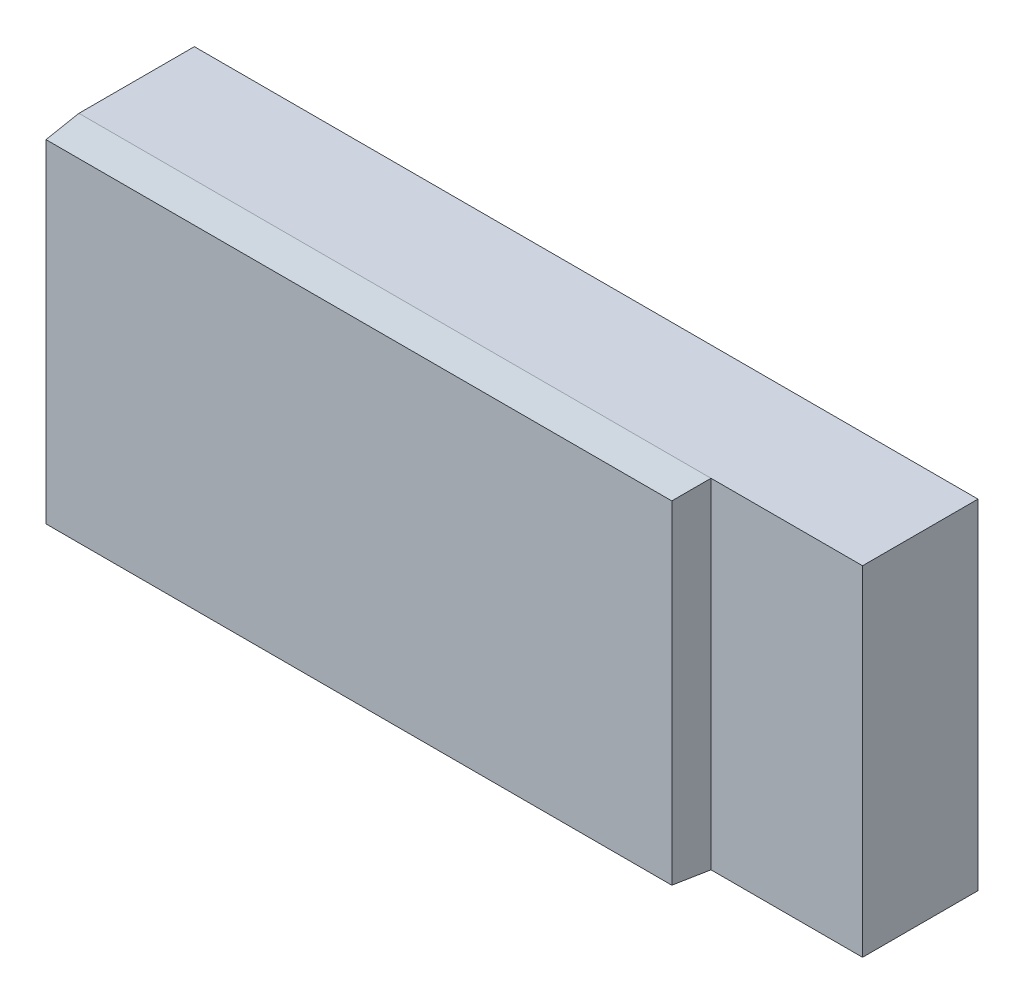
ISO-10303-21;
HEADER;
FILE_DESCRIPTION(('STEP AP214'),'2;1');
FILE_NAME('part.step','',(''),(''),'','','');
FILE_SCHEMA(('AUTOMOTIVE_DESIGN { 1 0 10303 214 1 1 1 1 }'));
ENDSEC;
DATA;
#1=APPLICATION_CONTEXT('core data for automotive mechanical design processes');
#2=APPLICATION_PROTOCOL_DEFINITION('international standard','automotive_design',2000,#1);
#3=PRODUCT_CONTEXT('',#1,'mechanical');
#4=PRODUCT('Part','Part','',(#3));
#5=PRODUCT_RELATED_PRODUCT_CATEGORY('part','',(#4));
#6=PRODUCT_DEFINITION_FORMATION('','',#4);
#7=PRODUCT_DEFINITION_CONTEXT('part definition',#1,'design');
#8=PRODUCT_DEFINITION('design','',#6,#7);
#9=PRODUCT_DEFINITION_SHAPE('','',#8);
#10=(LENGTH_UNIT() NAMED_UNIT(*) SI_UNIT(.MILLI.,.METRE.));
#11=(NAMED_UNIT(*) PLANE_ANGLE_UNIT() SI_UNIT($,.RADIAN.));
#12=(NAMED_UNIT(*) SI_UNIT($,.STERADIAN.) SOLID_ANGLE_UNIT());
#13=UNCERTAINTY_MEASURE_WITH_UNIT(LENGTH_MEASURE(1.E-05),#10,'distance_accuracy_value','');
#14=(GEOMETRIC_REPRESENTATION_CONTEXT(3) GLOBAL_UNCERTAINTY_ASSIGNED_CONTEXT((#13)) GLOBAL_UNIT_ASSIGNED_CONTEXT((#10,
#11,#12)) REPRESENTATION_CONTEXT('',''));
#15=CARTESIAN_POINT('',(0.,0.,0.));
#16=DIRECTION('',(0.,0.,1.));
#17=DIRECTION('',(1.,0.,0.));
#18=AXIS2_PLACEMENT_3D('',#15,#16,#17);
#19=CARTESIAN_POINT('',(0.,0.,4.));
#20=DIRECTION('',(0.,0.,-1.));
#21=DIRECTION('',(-1.,0.,0.));
#22=AXIS2_PLACEMENT_3D('',#19,#20,#21);
#23=PLANE('',#22);
#24=DIRECTION('',(0.,1.,0.));
#25=VECTOR('',#24,1.);
#26=CARTESIAN_POINT('',(8.325,5.875,4.));
#27=LINE('',#26,#25);
#28=CARTESIAN_POINT('',(8.32499999999999,-5.875,4.));
#29=VERTEX_POINT('',#28);
#30=CARTESIAN_POINT('',(8.325,5.875,4.));
#31=VERTEX_POINT('',#30);
#32=EDGE_CURVE('E50',#29,#31,#27,.T.);
#33=ORIENTED_EDGE('',*,*,#32,.F.);
#34=DIRECTION('',(1.,0.,0.));
#35=VECTOR('',#34,1.);
#36=CARTESIAN_POINT('',(-13.575,-5.875,4.));
#37=LINE('',#36,#35);
#38=CARTESIAN_POINT('',(13.575,-5.875,4.));
#39=VERTEX_POINT('',#38);
#40=EDGE_CURVE('E55',#29,#39,#37,.T.);
#41=ORIENTED_EDGE('',*,*,#40,.T.);
#42=DIRECTION('',(0.,1.,0.));
#43=VECTOR('',#42,1.);
#44=CARTESIAN_POINT('',(13.575,-5.875,4.));
#45=LINE('',#44,#43);
#46=CARTESIAN_POINT('',(13.575,5.875,4.));
#47=VERTEX_POINT('',#46);
#48=EDGE_CURVE('E99',#39,#47,#45,.T.);
#49=ORIENTED_EDGE('',*,*,#48,.T.);
#50=DIRECTION('',(-1.,0.,0.));
#51=VECTOR('',#50,1.);
#52=CARTESIAN_POINT('',(-13.575,5.875,4.));
#53=LINE('',#52,#51);
#54=EDGE_CURVE('E83',#47,#31,#53,.T.);
#55=ORIENTED_EDGE('',*,*,#54,.T.);
#56=EDGE_LOOP('',(#33,#41,#49,#55));
#57=FACE_BOUND('',#56,.T.);
#58=ADVANCED_FACE('F33',(#57),#23,.F.);
#59=CARTESIAN_POINT('',(13.575,-5.875,4.));
#60=DIRECTION('',(-1.,0.,0.));
#61=DIRECTION('',(0.,0.,1.));
#62=AXIS2_PLACEMENT_3D('',#59,#60,#61);
#63=PLANE('',#62);
#64=DIRECTION('',(0.,1.,0.));
#65=VECTOR('',#64,1.);
#66=CARTESIAN_POINT('',(13.575,-5.875,0.));
#67=LINE('',#66,#65);
#68=CARTESIAN_POINT('',(13.575,-5.875,0.));
#69=VERTEX_POINT('',#68);
#70=CARTESIAN_POINT('',(13.575,5.875,0.));
#71=VERTEX_POINT('',#70);
#72=EDGE_CURVE('E142',#69,#71,#67,.T.);
#73=ORIENTED_EDGE('',*,*,#72,.T.);
#74=DIRECTION('',(0.,0.,-1.));
#75=VECTOR('',#74,1.);
#76=CARTESIAN_POINT('',(13.575,5.875,4.));
#77=LINE('',#76,#75);
#78=EDGE_CURVE('E11',#47,#71,#77,.T.);
#79=ORIENTED_EDGE('',*,*,#78,.F.);
#80=ORIENTED_EDGE('',*,*,#48,.F.);
#81=DIRECTION('',(0.,0.,-1.));
#82=VECTOR('',#81,1.);
#83=CARTESIAN_POINT('',(13.575,-5.875,4.));
#84=LINE('',#83,#82);
#85=EDGE_CURVE('E165',#39,#69,#84,.T.);
#86=ORIENTED_EDGE('',*,*,#85,.T.);
#87=EDGE_LOOP('',(#73,#79,#80,#86));
#88=FACE_BOUND('',#87,.T.);
#89=ADVANCED_FACE('F35',(#88),#63,.F.);
#90=CARTESIAN_POINT('',(-13.575,5.875,4.));
#91=DIRECTION('',(0.,-1.,0.));
#92=DIRECTION('',(0.,0.,-1.));
#93=AXIS2_PLACEMENT_3D('',#90,#91,#92);
#94=PLANE('',#93);
#95=DIRECTION('',(-1.,0.,0.));
#96=VECTOR('',#95,1.);
#97=CARTESIAN_POINT('',(-13.575,5.875,0.));
#98=LINE('',#97,#96);
#99=CARTESIAN_POINT('',(-13.575,5.875,0.));
#100=VERTEX_POINT('',#99);
#101=EDGE_CURVE('E160',#71,#100,#98,.T.);
#102=ORIENTED_EDGE('',*,*,#101,.T.);
#103=DIRECTION('',(0.,0.,-1.));
#104=VECTOR('',#103,1.);
#105=CARTESIAN_POINT('',(-13.575,5.875,4.));
#106=LINE('',#105,#104);
#107=CARTESIAN_POINT('',(-13.575,5.875,4.));
#108=VERTEX_POINT('',#107);
#109=EDGE_CURVE('E42',#108,#100,#106,.T.);
#110=ORIENTED_EDGE('',*,*,#109,.F.);
#111=DIRECTION('',(-1.,0.,0.));
#112=VECTOR('',#111,1.);
#113=CARTESIAN_POINT('',(-13.575,5.875,4.));
#114=LINE('',#113,#112);
#115=EDGE_CURVE('E104',#31,#108,#114,.T.);
#116=ORIENTED_EDGE('',*,*,#115,.F.);
#117=ORIENTED_EDGE('',*,*,#54,.F.);
#118=ORIENTED_EDGE('',*,*,#78,.T.);
#119=EDGE_LOOP('',(#102,#110,#116,#117,#118));
#120=FACE_BOUND('',#119,.T.);
#121=ADVANCED_FACE('F105',(#120),#94,.F.);
#122=CARTESIAN_POINT('',(-13.575,-5.875,4.));
#123=DIRECTION('',(1.,0.,0.));
#124=DIRECTION('',(0.,0.,-1.));
#125=AXIS2_PLACEMENT_3D('',#122,#123,#124);
#126=PLANE('',#125);
#127=DIRECTION('',(0.,-1.,0.));
#128=VECTOR('',#127,1.);
#129=CARTESIAN_POINT('',(-13.575,-5.875,0.));
#130=LINE('',#129,#128);
#131=CARTESIAN_POINT('',(-13.575,-5.875,0.));
#132=VERTEX_POINT('',#131);
#133=EDGE_CURVE('E162',#100,#132,#130,.T.);
#134=ORIENTED_EDGE('',*,*,#133,.T.);
#135=DIRECTION('',(0.,0.,-1.));
#136=VECTOR('',#135,1.);
#137=CARTESIAN_POINT('',(-13.575,-5.875,4.));
#138=LINE('',#137,#136);
#139=CARTESIAN_POINT('',(-13.575,-5.875,4.));
#140=VERTEX_POINT('',#139);
#141=EDGE_CURVE('E167',#140,#132,#138,.T.);
#142=ORIENTED_EDGE('',*,*,#141,.F.);
#143=DIRECTION('',(0.,-1.,0.));
#144=VECTOR('',#143,1.);
#145=CARTESIAN_POINT('',(-13.575,-5.875,4.));
#146=LINE('',#145,#144);
#147=EDGE_CURVE('E101',#108,#140,#146,.T.);
#148=ORIENTED_EDGE('',*,*,#147,.F.);
#149=ORIENTED_EDGE('',*,*,#109,.T.);
#150=EDGE_LOOP('',(#134,#142,#148,#149));
#151=FACE_BOUND('',#150,.T.);
#152=ADVANCED_FACE('F170',(#151),#126,.F.);
#153=CARTESIAN_POINT('',(-13.575,-5.875,4.));
#154=DIRECTION('',(0.,1.,0.));
#155=DIRECTION('',(0.,0.,1.));
#156=AXIS2_PLACEMENT_3D('',#153,#154,#155);
#157=PLANE('',#156);
#158=DIRECTION('',(1.,0.,0.));
#159=VECTOR('',#158,1.);
#160=CARTESIAN_POINT('',(-13.575,-5.875,0.));
#161=LINE('',#160,#159);
#162=EDGE_CURVE('E77',#132,#69,#161,.T.);
#163=ORIENTED_EDGE('',*,*,#162,.T.);
#164=ORIENTED_EDGE('',*,*,#85,.F.);
#165=ORIENTED_EDGE('',*,*,#40,.F.);
#166=EDGE_CURVE('E136',#140,#29,#37,.T.);
#167=ORIENTED_EDGE('',*,*,#166,.F.);
#168=ORIENTED_EDGE('',*,*,#141,.T.);
#169=EDGE_LOOP('',(#163,#164,#165,#167,#168));
#170=FACE_BOUND('',#169,.T.);
#171=ADVANCED_FACE('F176',(#170),#157,.F.);
#172=CARTESIAN_POINT('',(0.,0.,0.));
#173=DIRECTION('',(0.,0.,-1.));
#174=DIRECTION('',(-1.,0.,0.));
#175=AXIS2_PLACEMENT_3D('',#172,#173,#174);
#176=PLANE('',#175);
#177=ORIENTED_EDGE('',*,*,#72,.F.);
#178=ORIENTED_EDGE('',*,*,#162,.F.);
#179=ORIENTED_EDGE('',*,*,#133,.F.);
#180=ORIENTED_EDGE('',*,*,#101,.F.);
#181=EDGE_LOOP('',(#177,#178,#179,#180));
#182=FACE_BOUND('',#181,.T.);
#183=ADVANCED_FACE('F174',(#182),#176,.T.);
#184=CARTESIAN_POINT('',(-13.575,5.875,4.));
#185=DIRECTION('',(-0.996194698091746,0.,0.0871557427476584));
#186=DIRECTION('',(0.0871557427476584,0.,0.996194698091746));
#187=AXIS2_PLACEMENT_3D('',#184,#185,#186);
#188=PLANE('',#187);
#189=ORIENTED_EDGE('',*,*,#147,.T.);
#190=DIRECTION('',(-0.0868265938642478,-0.0868265938642478,-0.992432509138967));
#191=VECTOR('',#190,1.);
#192=CARTESIAN_POINT('',(-13.575,-5.875,4.));
#193=LINE('',#192,#191);
#194=CARTESIAN_POINT('',(-13.4656391705926,-5.76563917059259,5.25));
#195=VERTEX_POINT('',#194);
#196=EDGE_CURVE('E128',#195,#140,#193,.T.);
#197=ORIENTED_EDGE('',*,*,#196,.F.);
#198=DIRECTION('',(0.,1.,0.));
#199=VECTOR('',#198,1.);
#200=CARTESIAN_POINT('',(-13.4656391705926,5.875,5.25));
#201=LINE('',#200,#199);
#202=CARTESIAN_POINT('',(-13.4656391705926,5.7656391705926,5.25));
#203=VERTEX_POINT('',#202);
#204=EDGE_CURVE('E112',#203,#195,#201,.F.);
#205=ORIENTED_EDGE('',*,*,#204,.F.);
#206=DIRECTION('',(-0.0868265938642478,0.0868265938642478,-0.992432509138967));
#207=VECTOR('',#206,1.);
#208=CARTESIAN_POINT('',(-13.575,5.875,4.));
#209=LINE('',#208,#207);
#210=EDGE_CURVE('E126',#203,#108,#209,.T.);
#211=ORIENTED_EDGE('',*,*,#210,.T.);
#212=EDGE_LOOP('',(#189,#197,#205,#211));
#213=FACE_BOUND('',#212,.T.);
#214=ADVANCED_FACE('F184',(#213),#188,.T.);
#215=CARTESIAN_POINT('',(-13.575,-5.875,4.));
#216=DIRECTION('',(0.,-0.996194698091746,0.0871557427476584));
#217=DIRECTION('',(0.,-0.0871557427476584,-0.996194698091746));
#218=AXIS2_PLACEMENT_3D('',#215,#216,#217);
#219=PLANE('',#218);
#220=ORIENTED_EDGE('',*,*,#166,.T.);
#221=DIRECTION('',(0.0868265938642478,-0.0868265938642478,-0.992432509138967));
#222=VECTOR('',#221,1.);
#223=CARTESIAN_POINT('',(8.23641842552571,-5.78641842552571,5.01249202930205));
#224=LINE('',#223,#222);
#225=CARTESIAN_POINT('',(8.21563917059259,-5.76563917059259,5.25));
#226=VERTEX_POINT('',#225);
#227=EDGE_CURVE('E122',#226,#29,#224,.T.);
#228=ORIENTED_EDGE('',*,*,#227,.F.);
#229=DIRECTION('',(-1.,0.,0.));
#230=VECTOR('',#229,1.);
#231=CARTESIAN_POINT('',(-13.575,-5.76563917059259,5.25));
#232=LINE('',#231,#230);
#233=EDGE_CURVE('E146',#195,#226,#232,.F.);
#234=ORIENTED_EDGE('',*,*,#233,.F.);
#235=ORIENTED_EDGE('',*,*,#196,.T.);
#236=EDGE_LOOP('',(#220,#228,#234,#235));
#237=FACE_BOUND('',#236,.T.);
#238=ADVANCED_FACE('F180',(#237),#219,.T.);
#239=CARTESIAN_POINT('',(8.325,5.875,4.));
#240=DIRECTION('',(0.996194698091746,0.,0.0871557427476584));
#241=DIRECTION('',(0.0871557427476584,0.,-0.996194698091746));
#242=AXIS2_PLACEMENT_3D('',#239,#240,#241);
#243=PLANE('',#242);
#244=ORIENTED_EDGE('',*,*,#32,.T.);
#245=DIRECTION('',(0.0868265938642478,0.0868265938642478,-0.992432509138967));
#246=VECTOR('',#245,1.);
#247=CARTESIAN_POINT('',(8.15989902289473,5.70989902289473,5.88711280355021));
#248=LINE('',#247,#246);
#249=CARTESIAN_POINT('',(8.21563917059259,5.7656391705926,5.25));
#250=VERTEX_POINT('',#249);
#251=EDGE_CURVE('E119',#250,#31,#248,.T.);
#252=ORIENTED_EDGE('',*,*,#251,.F.);
#253=DIRECTION('',(0.,-1.,0.));
#254=VECTOR('',#253,1.);
#255=CARTESIAN_POINT('',(8.21563917059259,5.875,5.25));
#256=LINE('',#255,#254);
#257=EDGE_CURVE('E148',#226,#250,#256,.F.);
#258=ORIENTED_EDGE('',*,*,#257,.F.);
#259=ORIENTED_EDGE('',*,*,#227,.T.);
#260=EDGE_LOOP('',(#244,#252,#258,#259));
#261=FACE_BOUND('',#260,.T.);
#262=ADVANCED_FACE('F117',(#261),#243,.T.);
#263=CARTESIAN_POINT('',(-13.575,5.875,4.));
#264=DIRECTION('',(0.,0.996194698091746,0.0871557427476584));
#265=DIRECTION('',(0.,-0.0871557427476584,0.996194698091746));
#266=AXIS2_PLACEMENT_3D('',#263,#264,#265);
#267=PLANE('',#266);
#268=ORIENTED_EDGE('',*,*,#115,.T.);
#269=ORIENTED_EDGE('',*,*,#210,.F.);
#270=DIRECTION('',(1.,0.,0.));
#271=VECTOR('',#270,1.);
#272=CARTESIAN_POINT('',(-13.575,5.7656391705926,5.25));
#273=LINE('',#272,#271);
#274=EDGE_CURVE('E125',#250,#203,#273,.F.);
#275=ORIENTED_EDGE('',*,*,#274,.F.);
#276=ORIENTED_EDGE('',*,*,#251,.T.);
#277=EDGE_LOOP('',(#268,#269,#275,#276));
#278=FACE_BOUND('',#277,.T.);
#279=ADVANCED_FACE('F124',(#278),#267,.T.);
#280=CARTESIAN_POINT('',(0.,0.,5.25));
#281=DIRECTION('',(0.,0.,1.));
#282=DIRECTION('',(1.,0.,0.));
#283=AXIS2_PLACEMENT_3D('',#280,#281,#282);
#284=PLANE('',#283);
#285=ORIENTED_EDGE('',*,*,#204,.T.);
#286=ORIENTED_EDGE('',*,*,#233,.T.);
#287=ORIENTED_EDGE('',*,*,#257,.T.);
#288=ORIENTED_EDGE('',*,*,#274,.T.);
#289=EDGE_LOOP('',(#285,#286,#287,#288));
#290=FACE_BOUND('',#289,.T.);
#291=ADVANCED_FACE('F186',(#290),#284,.T.);
#292=CLOSED_SHELL('',(#58,#89,#121,#152,#171,#183,#214,#238,#262,#279,#291));
#293=MANIFOLD_SOLID_BREP('B2',#292);
#294=ADVANCED_BREP_SHAPE_REPRESENTATION('',(#18,#293),#14);
#295=SHAPE_DEFINITION_REPRESENTATION(#9,#294);
ENDSEC;
END-ISO-10303-21;
